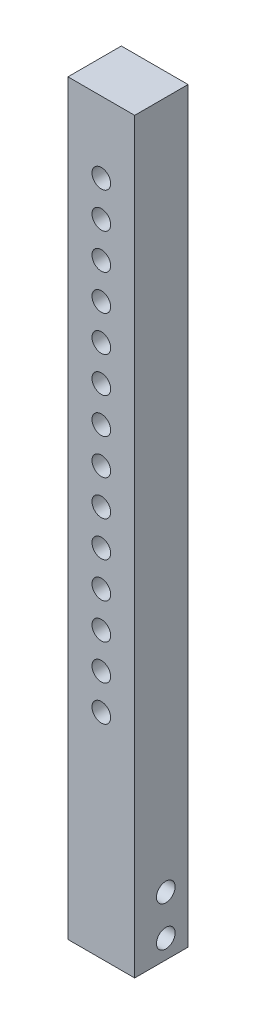
ISO-10303-21;
HEADER;
FILE_DESCRIPTION(('STEP AP214'),'2;1');
FILE_NAME('part.step','',(''),(''),'','','');
FILE_SCHEMA(('AUTOMOTIVE_DESIGN { 1 0 10303 214 1 1 1 1 }'));
ENDSEC;
DATA;
#1=APPLICATION_CONTEXT('core data for automotive mechanical design processes');
#2=APPLICATION_PROTOCOL_DEFINITION('international standard','automotive_design',2000,#1);
#3=PRODUCT_CONTEXT('',#1,'mechanical');
#4=PRODUCT('Part','Part','',(#3));
#5=PRODUCT_RELATED_PRODUCT_CATEGORY('part','',(#4));
#6=PRODUCT_DEFINITION_FORMATION('','',#4);
#7=PRODUCT_DEFINITION_CONTEXT('part definition',#1,'design');
#8=PRODUCT_DEFINITION('design','',#6,#7);
#9=PRODUCT_DEFINITION_SHAPE('','',#8);
#10=(LENGTH_UNIT() NAMED_UNIT(*) SI_UNIT(.MILLI.,.METRE.));
#11=(NAMED_UNIT(*) PLANE_ANGLE_UNIT() SI_UNIT($,.RADIAN.));
#12=(NAMED_UNIT(*) SI_UNIT($,.STERADIAN.) SOLID_ANGLE_UNIT());
#13=UNCERTAINTY_MEASURE_WITH_UNIT(LENGTH_MEASURE(1.E-05),#10,'distance_accuracy_value','');
#14=(GEOMETRIC_REPRESENTATION_CONTEXT(3) GLOBAL_UNCERTAINTY_ASSIGNED_CONTEXT((#13)) GLOBAL_UNIT_ASSIGNED_CONTEXT((#10,
#11,#12)) REPRESENTATION_CONTEXT('',''));
#15=CARTESIAN_POINT('',(0.,0.,0.));
#16=DIRECTION('',(0.,0.,1.));
#17=DIRECTION('',(1.,0.,0.));
#18=AXIS2_PLACEMENT_3D('',#15,#16,#17);
#19=CARTESIAN_POINT('',(-7.5,-85.,12.));
#20=DIRECTION('',(1.,0.,0.));
#21=DIRECTION('',(0.,0.,-1.));
#22=AXIS2_PLACEMENT_3D('',#19,#20,#21);
#23=PLANE('',#22);
#24=CARTESIAN_POINT('',(-7.5,-69.75,5.));
#25=DIRECTION('',(1.,0.,0.));
#26=DIRECTION('',(0.,0.,-1.));
#27=AXIS2_PLACEMENT_3D('',#24,#25,#26);
#28=CIRCLE('',#27,2.1);
#29=CARTESIAN_POINT('',(-7.5,-69.75,2.9));
#30=VERTEX_POINT('',#29);
#31=EDGE_CURVE('E163',#30,#30,#28,.F.);
#32=ORIENTED_EDGE('',*,*,#31,.F.);
#33=EDGE_LOOP('',(#32));
#34=FACE_BOUND('',#33,.T.);
#35=CARTESIAN_POINT('',(-7.5,-78.75,5.));
#36=DIRECTION('',(1.,0.,0.));
#37=DIRECTION('',(0.,0.,-1.));
#38=AXIS2_PLACEMENT_3D('',#35,#36,#37);
#39=CIRCLE('',#38,2.10000000000001);
#40=CARTESIAN_POINT('',(-7.5,-78.75,2.89999999999999));
#41=VERTEX_POINT('',#40);
#42=EDGE_CURVE('E342',#41,#41,#39,.F.);
#43=ORIENTED_EDGE('',*,*,#42,.F.);
#44=EDGE_LOOP('',(#43));
#45=FACE_BOUND('',#44,.T.);
#46=DIRECTION('',(0.,-1.,0.));
#47=VECTOR('',#46,1.);
#48=CARTESIAN_POINT('',(-7.5,-85.,0.));
#49=LINE('',#48,#47);
#50=CARTESIAN_POINT('',(-7.5,85.,0.));
#51=VERTEX_POINT('',#50);
#52=CARTESIAN_POINT('',(-7.5,-83.,0.));
#53=VERTEX_POINT('',#52);
#54=EDGE_CURVE('E127',#51,#53,#49,.T.);
#55=ORIENTED_EDGE('',*,*,#54,.T.);
#56=DIRECTION('',(0.,0.,-1.));
#57=VECTOR('',#56,1.);
#58=CARTESIAN_POINT('',(-7.5,-83.,0.));
#59=LINE('',#58,#57);
#60=CARTESIAN_POINT('',(-7.5,-83.,12.));
#61=VERTEX_POINT('',#60);
#62=EDGE_CURVE('E107',#61,#53,#59,.T.);
#63=ORIENTED_EDGE('',*,*,#62,.F.);
#64=DIRECTION('',(0.,-1.,0.));
#65=VECTOR('',#64,1.);
#66=CARTESIAN_POINT('',(-7.5,-85.,12.));
#67=LINE('',#66,#65);
#68=CARTESIAN_POINT('',(-7.5,85.,12.));
#69=VERTEX_POINT('',#68);
#70=EDGE_CURVE('E153',#69,#61,#67,.T.);
#71=ORIENTED_EDGE('',*,*,#70,.F.);
#72=DIRECTION('',(0.,0.,-1.));
#73=VECTOR('',#72,1.);
#74=CARTESIAN_POINT('',(-7.5,85.,12.));
#75=LINE('',#74,#73);
#76=EDGE_CURVE('E135',#69,#51,#75,.T.);
#77=ORIENTED_EDGE('',*,*,#76,.T.);
#78=EDGE_LOOP('',(#55,#63,#71,#77));
#79=FACE_BOUND('',#78,.T.);
#80=ADVANCED_FACE('F43',(#34,#45,#79),#23,.F.);
#81=CARTESIAN_POINT('',(7.5,-85.,12.));
#82=DIRECTION('',(-1.,0.,0.));
#83=DIRECTION('',(0.,0.,1.));
#84=AXIS2_PLACEMENT_3D('',#81,#82,#83);
#85=PLANE('',#84);
#86=CARTESIAN_POINT('',(7.5,-69.75,5.));
#87=DIRECTION('',(1.,0.,0.));
#88=DIRECTION('',(0.,0.,-1.));
#89=AXIS2_PLACEMENT_3D('',#86,#87,#88);
#90=CIRCLE('',#89,2.1);
#91=CARTESIAN_POINT('',(7.5,-69.75,2.9));
#92=VERTEX_POINT('',#91);
#93=EDGE_CURVE('E343',#92,#92,#90,.T.);
#94=ORIENTED_EDGE('',*,*,#93,.F.);
#95=EDGE_LOOP('',(#94));
#96=FACE_BOUND('',#95,.T.);
#97=CARTESIAN_POINT('',(7.5,-78.75,5.));
#98=DIRECTION('',(1.,0.,0.));
#99=DIRECTION('',(0.,0.,-1.));
#100=AXIS2_PLACEMENT_3D('',#97,#98,#99);
#101=CIRCLE('',#100,2.10000000000001);
#102=CARTESIAN_POINT('',(7.5,-78.75,2.89999999999999));
#103=VERTEX_POINT('',#102);
#104=EDGE_CURVE('E179',#103,#103,#101,.T.);
#105=ORIENTED_EDGE('',*,*,#104,.F.);
#106=EDGE_LOOP('',(#105));
#107=FACE_BOUND('',#106,.T.);
#108=DIRECTION('',(0.,1.,0.));
#109=VECTOR('',#108,1.);
#110=CARTESIAN_POINT('',(7.5,-85.,12.));
#111=LINE('',#110,#109);
#112=CARTESIAN_POINT('',(7.5,-83.,12.));
#113=VERTEX_POINT('',#112);
#114=CARTESIAN_POINT('',(7.5,85.,12.));
#115=VERTEX_POINT('',#114);
#116=EDGE_CURVE('E204',#113,#115,#111,.T.);
#117=ORIENTED_EDGE('',*,*,#116,.F.);
#118=DIRECTION('',(0.,0.,1.));
#119=VECTOR('',#118,1.);
#120=CARTESIAN_POINT('',(7.5,-83.,0.));
#121=LINE('',#120,#119);
#122=CARTESIAN_POINT('',(7.5,-83.,0.));
#123=VERTEX_POINT('',#122);
#124=EDGE_CURVE('E131',#123,#113,#121,.T.);
#125=ORIENTED_EDGE('',*,*,#124,.F.);
#126=DIRECTION('',(0.,1.,0.));
#127=VECTOR('',#126,1.);
#128=CARTESIAN_POINT('',(7.5,-85.,0.));
#129=LINE('',#128,#127);
#130=CARTESIAN_POINT('',(7.5,85.,0.));
#131=VERTEX_POINT('',#130);
#132=EDGE_CURVE('E137',#123,#131,#129,.T.);
#133=ORIENTED_EDGE('',*,*,#132,.T.);
#134=DIRECTION('',(0.,0.,-1.));
#135=VECTOR('',#134,1.);
#136=CARTESIAN_POINT('',(7.5,85.,12.));
#137=LINE('',#136,#135);
#138=EDGE_CURVE('E51',#115,#131,#137,.T.);
#139=ORIENTED_EDGE('',*,*,#138,.F.);
#140=EDGE_LOOP('',(#117,#125,#133,#139));
#141=FACE_BOUND('',#140,.T.);
#142=ADVANCED_FACE('F219',(#96,#107,#141),#85,.F.);
#143=CARTESIAN_POINT('',(7.5,85.,12.));
#144=DIRECTION('',(0.,-1.,0.));
#145=DIRECTION('',(0.,0.,-1.));
#146=AXIS2_PLACEMENT_3D('',#143,#144,#145);
#147=PLANE('',#146);
#148=DIRECTION('',(-1.,0.,0.));
#149=VECTOR('',#148,1.);
#150=CARTESIAN_POINT('',(7.5,85.,0.));
#151=LINE('',#150,#149);
#152=EDGE_CURVE('E142',#131,#51,#151,.T.);
#153=ORIENTED_EDGE('',*,*,#152,.T.);
#154=ORIENTED_EDGE('',*,*,#76,.F.);
#155=DIRECTION('',(-1.,0.,0.));
#156=VECTOR('',#155,1.);
#157=CARTESIAN_POINT('',(7.5,85.,12.));
#158=LINE('',#157,#156);
#159=EDGE_CURVE('E148',#115,#69,#158,.T.);
#160=ORIENTED_EDGE('',*,*,#159,.F.);
#161=ORIENTED_EDGE('',*,*,#138,.T.);
#162=EDGE_LOOP('',(#153,#154,#160,#161));
#163=FACE_BOUND('',#162,.T.);
#164=ADVANCED_FACE('F214',(#163),#147,.F.);
#165=CARTESIAN_POINT('',(0.,0.,12.));
#166=DIRECTION('',(0.,0.,1.));
#167=DIRECTION('',(1.,0.,0.));
#168=AXIS2_PLACEMENT_3D('',#165,#166,#167);
#169=PLANE('',#168);
#170=DIRECTION('',(-1.,0.,0.));
#171=VECTOR('',#170,1.);
#172=CARTESIAN_POINT('',(-7.5,-83.,12.));
#173=LINE('',#172,#171);
#174=EDGE_CURVE('E113',#113,#61,#173,.T.);
#175=ORIENTED_EDGE('',*,*,#174,.F.);
#176=ORIENTED_EDGE('',*,*,#116,.T.);
#177=ORIENTED_EDGE('',*,*,#159,.T.);
#178=ORIENTED_EDGE('',*,*,#70,.T.);
#179=EDGE_LOOP('',(#175,#176,#177,#178));
#180=FACE_BOUND('',#179,.T.);
#181=CARTESIAN_POINT('',(0.,-3.00000000000002,12.));
#182=DIRECTION('',(0.,0.,1.));
#183=DIRECTION('',(1.,0.,0.));
#184=AXIS2_PLACEMENT_3D('',#181,#182,#183);
#185=CIRCLE('',#184,2.1);
#186=CARTESIAN_POINT('',(2.1,-3.00000000000002,12.));
#187=VERTEX_POINT('',#186);
#188=EDGE_CURVE('E291',#187,#187,#185,.T.);
#189=ORIENTED_EDGE('',*,*,#188,.F.);
#190=EDGE_LOOP('',(#189));
#191=FACE_BOUND('',#190,.T.);
#192=CARTESIAN_POINT('',(0.,21.,12.));
#193=DIRECTION('',(0.,0.,1.));
#194=DIRECTION('',(1.,0.,0.));
#195=AXIS2_PLACEMENT_3D('',#192,#193,#194);
#196=CIRCLE('',#195,2.1);
#197=CARTESIAN_POINT('',(2.1,21.,12.));
#198=VERTEX_POINT('',#197);
#199=EDGE_CURVE('E292',#198,#198,#196,.T.);
#200=ORIENTED_EDGE('',*,*,#199,.F.);
#201=EDGE_LOOP('',(#200));
#202=FACE_BOUND('',#201,.T.);
#203=CARTESIAN_POINT('',(0.,13.,12.));
#204=DIRECTION('',(0.,0.,1.));
#205=DIRECTION('',(1.,0.,0.));
#206=AXIS2_PLACEMENT_3D('',#203,#204,#205);
#207=CIRCLE('',#206,2.1);
#208=CARTESIAN_POINT('',(2.1,13.,12.));
#209=VERTEX_POINT('',#208);
#210=EDGE_CURVE('E275',#209,#209,#207,.T.);
#211=ORIENTED_EDGE('',*,*,#210,.F.);
#212=EDGE_LOOP('',(#211));
#213=FACE_BOUND('',#212,.T.);
#214=CARTESIAN_POINT('',(0.,37.,12.));
#215=DIRECTION('',(0.,0.,1.));
#216=DIRECTION('',(1.,0.,0.));
#217=AXIS2_PLACEMENT_3D('',#214,#215,#216);
#218=CIRCLE('',#217,2.1);
#219=CARTESIAN_POINT('',(2.1,37.,12.));
#220=VERTEX_POINT('',#219);
#221=EDGE_CURVE('E276',#220,#220,#218,.T.);
#222=ORIENTED_EDGE('',*,*,#221,.F.);
#223=EDGE_LOOP('',(#222));
#224=FACE_BOUND('',#223,.T.);
#225=CARTESIAN_POINT('',(0.,-35.,12.));
#226=DIRECTION('',(0.,0.,1.));
#227=DIRECTION('',(1.,0.,0.));
#228=AXIS2_PLACEMENT_3D('',#225,#226,#227);
#229=CIRCLE('',#228,2.1);
#230=CARTESIAN_POINT('',(2.1,-35.,12.));
#231=VERTEX_POINT('',#230);
#232=EDGE_CURVE('E323',#231,#231,#229,.T.);
#233=ORIENTED_EDGE('',*,*,#232,.F.);
#234=EDGE_LOOP('',(#233));
#235=FACE_BOUND('',#234,.T.);
#236=CARTESIAN_POINT('',(0.,-11.,12.));
#237=DIRECTION('',(0.,0.,1.));
#238=DIRECTION('',(1.,0.,0.));
#239=AXIS2_PLACEMENT_3D('',#236,#237,#238);
#240=CIRCLE('',#239,2.1);
#241=CARTESIAN_POINT('',(2.1,-11.,12.));
#242=VERTEX_POINT('',#241);
#243=EDGE_CURVE('E324',#242,#242,#240,.T.);
#244=ORIENTED_EDGE('',*,*,#243,.F.);
#245=EDGE_LOOP('',(#244));
#246=FACE_BOUND('',#245,.T.);
#247=CARTESIAN_POINT('',(0.,-19.,12.));
#248=DIRECTION('',(0.,0.,1.));
#249=DIRECTION('',(1.,0.,0.));
#250=AXIS2_PLACEMENT_3D('',#247,#248,#249);
#251=CIRCLE('',#250,2.1);
#252=CARTESIAN_POINT('',(2.1,-19.,12.));
#253=VERTEX_POINT('',#252);
#254=EDGE_CURVE('E307',#253,#253,#251,.T.);
#255=ORIENTED_EDGE('',*,*,#254,.F.);
#256=EDGE_LOOP('',(#255));
#257=FACE_BOUND('',#256,.T.);
#258=CARTESIAN_POINT('',(0.,4.99999999999998,12.));
#259=DIRECTION('',(0.,0.,1.));
#260=DIRECTION('',(1.,0.,0.));
#261=AXIS2_PLACEMENT_3D('',#258,#259,#260);
#262=CIRCLE('',#261,2.1);
#263=CARTESIAN_POINT('',(2.1,4.99999999999998,12.));
#264=VERTEX_POINT('',#263);
#265=EDGE_CURVE('E308',#264,#264,#262,.T.);
#266=ORIENTED_EDGE('',*,*,#265,.F.);
#267=EDGE_LOOP('',(#266));
#268=FACE_BOUND('',#267,.T.);
#269=CARTESIAN_POINT('',(0.,61.,12.));
#270=DIRECTION('',(0.,0.,1.));
#271=DIRECTION('',(1.,0.,0.));
#272=AXIS2_PLACEMENT_3D('',#269,#270,#271);
#273=CIRCLE('',#272,2.1);
#274=CARTESIAN_POINT('',(2.1,61.,12.));
#275=VERTEX_POINT('',#274);
#276=EDGE_CURVE('E234',#275,#275,#273,.T.);
#277=ORIENTED_EDGE('',*,*,#276,.F.);
#278=EDGE_LOOP('',(#277));
#279=FACE_BOUND('',#278,.T.);
#280=CARTESIAN_POINT('',(0.,29.,12.));
#281=DIRECTION('',(0.,0.,1.));
#282=DIRECTION('',(1.,0.,0.));
#283=AXIS2_PLACEMENT_3D('',#280,#281,#282);
#284=CIRCLE('',#283,2.1);
#285=CARTESIAN_POINT('',(2.1,29.,12.));
#286=VERTEX_POINT('',#285);
#287=EDGE_CURVE('E259',#286,#286,#284,.T.);
#288=ORIENTED_EDGE('',*,*,#287,.F.);
#289=EDGE_LOOP('',(#288));
#290=FACE_BOUND('',#289,.T.);
#291=CARTESIAN_POINT('',(0.,53.,12.));
#292=DIRECTION('',(0.,0.,1.));
#293=DIRECTION('',(1.,0.,0.));
#294=AXIS2_PLACEMENT_3D('',#291,#292,#293);
#295=CIRCLE('',#294,2.1);
#296=CARTESIAN_POINT('',(2.1,53.,12.));
#297=VERTEX_POINT('',#296);
#298=EDGE_CURVE('E260',#297,#297,#295,.T.);
#299=ORIENTED_EDGE('',*,*,#298,.F.);
#300=EDGE_LOOP('',(#299));
#301=FACE_BOUND('',#300,.T.);
#302=CARTESIAN_POINT('',(0.,45.,12.));
#303=DIRECTION('',(0.,0.,1.));
#304=DIRECTION('',(1.,0.,0.));
#305=AXIS2_PLACEMENT_3D('',#302,#303,#304);
#306=CIRCLE('',#305,2.1);
#307=CARTESIAN_POINT('',(2.1,45.,12.));
#308=VERTEX_POINT('',#307);
#309=EDGE_CURVE('E243',#308,#308,#306,.T.);
#310=ORIENTED_EDGE('',*,*,#309,.F.);
#311=EDGE_LOOP('',(#310));
#312=FACE_BOUND('',#311,.T.);
#313=CARTESIAN_POINT('',(0.,69.,12.));
#314=DIRECTION('',(0.,0.,1.));
#315=DIRECTION('',(1.,0.,0.));
#316=AXIS2_PLACEMENT_3D('',#313,#314,#315);
#317=CIRCLE('',#316,2.1);
#318=CARTESIAN_POINT('',(2.1,69.,12.));
#319=VERTEX_POINT('',#318);
#320=EDGE_CURVE('E244',#319,#319,#317,.T.);
#321=ORIENTED_EDGE('',*,*,#320,.F.);
#322=EDGE_LOOP('',(#321));
#323=FACE_BOUND('',#322,.T.);
#324=CARTESIAN_POINT('',(0.,-27.,12.));
#325=DIRECTION('',(0.,0.,1.));
#326=DIRECTION('',(1.,0.,0.));
#327=AXIS2_PLACEMENT_3D('',#324,#325,#326);
#328=CIRCLE('',#327,2.1);
#329=CARTESIAN_POINT('',(2.1,-27.,12.));
#330=VERTEX_POINT('',#329);
#331=EDGE_CURVE('E328',#330,#330,#328,.T.);
#332=ORIENTED_EDGE('',*,*,#331,.F.);
#333=EDGE_LOOP('',(#332));
#334=FACE_BOUND('',#333,.T.);
#335=ADVANCED_FACE('F211',(#180,#191,#202,#213,#224,#235,#246,#257,#268,#279,#290,#301,#312,
#323,#334),#169,.T.);
#336=CARTESIAN_POINT('',(0.,0.,0.));
#337=DIRECTION('',(0.,0.,1.));
#338=DIRECTION('',(1.,0.,0.));
#339=AXIS2_PLACEMENT_3D('',#336,#337,#338);
#340=PLANE('',#339);
#341=CARTESIAN_POINT('',(0.,-3.00000000000002,0.));
#342=DIRECTION('',(0.,0.,1.));
#343=DIRECTION('',(1.,0.,0.));
#344=AXIS2_PLACEMENT_3D('',#341,#342,#343);
#345=CIRCLE('',#344,2.1);
#346=CARTESIAN_POINT('',(2.1,-3.00000000000002,0.));
#347=VERTEX_POINT('',#346);
#348=EDGE_CURVE('E287',#347,#347,#345,.F.);
#349=ORIENTED_EDGE('',*,*,#348,.F.);
#350=EDGE_LOOP('',(#349));
#351=FACE_BOUND('',#350,.T.);
#352=CARTESIAN_POINT('',(0.,21.,0.));
#353=DIRECTION('',(0.,0.,1.));
#354=DIRECTION('',(1.,0.,0.));
#355=AXIS2_PLACEMENT_3D('',#352,#353,#354);
#356=CIRCLE('',#355,2.1);
#357=CARTESIAN_POINT('',(2.1,21.,0.));
#358=VERTEX_POINT('',#357);
#359=EDGE_CURVE('E280',#358,#358,#356,.F.);
#360=ORIENTED_EDGE('',*,*,#359,.F.);
#361=EDGE_LOOP('',(#360));
#362=FACE_BOUND('',#361,.T.);
#363=CARTESIAN_POINT('',(0.,13.,0.));
#364=DIRECTION('',(0.,0.,1.));
#365=DIRECTION('',(1.,0.,0.));
#366=AXIS2_PLACEMENT_3D('',#363,#364,#365);
#367=CIRCLE('',#366,2.1);
#368=CARTESIAN_POINT('',(2.1,13.,0.));
#369=VERTEX_POINT('',#368);
#370=EDGE_CURVE('E271',#369,#369,#367,.F.);
#371=ORIENTED_EDGE('',*,*,#370,.F.);
#372=EDGE_LOOP('',(#371));
#373=FACE_BOUND('',#372,.T.);
#374=CARTESIAN_POINT('',(0.,37.,0.));
#375=DIRECTION('',(0.,0.,1.));
#376=DIRECTION('',(1.,0.,0.));
#377=AXIS2_PLACEMENT_3D('',#374,#375,#376);
#378=CIRCLE('',#377,2.1);
#379=CARTESIAN_POINT('',(2.1,37.,0.));
#380=VERTEX_POINT('',#379);
#381=EDGE_CURVE('E264',#380,#380,#378,.F.);
#382=ORIENTED_EDGE('',*,*,#381,.F.);
#383=EDGE_LOOP('',(#382));
#384=FACE_BOUND('',#383,.T.);
#385=CARTESIAN_POINT('',(0.,-35.,0.));
#386=DIRECTION('',(0.,0.,1.));
#387=DIRECTION('',(1.,0.,0.));
#388=AXIS2_PLACEMENT_3D('',#385,#386,#387);
#389=CIRCLE('',#388,2.1);
#390=CARTESIAN_POINT('',(2.1,-35.,0.));
#391=VERTEX_POINT('',#390);
#392=EDGE_CURVE('E319',#391,#391,#389,.F.);
#393=ORIENTED_EDGE('',*,*,#392,.F.);
#394=EDGE_LOOP('',(#393));
#395=FACE_BOUND('',#394,.T.);
#396=CARTESIAN_POINT('',(0.,-11.,0.));
#397=DIRECTION('',(0.,0.,1.));
#398=DIRECTION('',(1.,0.,0.));
#399=AXIS2_PLACEMENT_3D('',#396,#397,#398);
#400=CIRCLE('',#399,2.1);
#401=CARTESIAN_POINT('',(2.1,-11.,0.));
#402=VERTEX_POINT('',#401);
#403=EDGE_CURVE('E312',#402,#402,#400,.F.);
#404=ORIENTED_EDGE('',*,*,#403,.F.);
#405=EDGE_LOOP('',(#404));
#406=FACE_BOUND('',#405,.T.);
#407=CARTESIAN_POINT('',(0.,-19.,0.));
#408=DIRECTION('',(0.,0.,1.));
#409=DIRECTION('',(1.,0.,0.));
#410=AXIS2_PLACEMENT_3D('',#407,#408,#409);
#411=CIRCLE('',#410,2.1);
#412=CARTESIAN_POINT('',(2.1,-19.,0.));
#413=VERTEX_POINT('',#412);
#414=EDGE_CURVE('E303',#413,#413,#411,.F.);
#415=ORIENTED_EDGE('',*,*,#414,.F.);
#416=EDGE_LOOP('',(#415));
#417=FACE_BOUND('',#416,.T.);
#418=CARTESIAN_POINT('',(0.,4.99999999999998,0.));
#419=DIRECTION('',(0.,0.,1.));
#420=DIRECTION('',(1.,0.,0.));
#421=AXIS2_PLACEMENT_3D('',#418,#419,#420);
#422=CIRCLE('',#421,2.1);
#423=CARTESIAN_POINT('',(2.1,4.99999999999998,0.));
#424=VERTEX_POINT('',#423);
#425=EDGE_CURVE('E296',#424,#424,#422,.F.);
#426=ORIENTED_EDGE('',*,*,#425,.F.);
#427=EDGE_LOOP('',(#426));
#428=FACE_BOUND('',#427,.T.);
#429=CARTESIAN_POINT('',(0.,61.,0.));
#430=DIRECTION('',(0.,0.,1.));
#431=DIRECTION('',(1.,0.,0.));
#432=AXIS2_PLACEMENT_3D('',#429,#430,#431);
#433=CIRCLE('',#432,2.1);
#434=CARTESIAN_POINT('',(2.1,61.,0.));
#435=VERTEX_POINT('',#434);
#436=EDGE_CURVE('E230',#435,#435,#433,.F.);
#437=ORIENTED_EDGE('',*,*,#436,.F.);
#438=EDGE_LOOP('',(#437));
#439=FACE_BOUND('',#438,.T.);
#440=CARTESIAN_POINT('',(0.,29.,0.));
#441=DIRECTION('',(0.,0.,1.));
#442=DIRECTION('',(1.,0.,0.));
#443=AXIS2_PLACEMENT_3D('',#440,#441,#442);
#444=CIRCLE('',#443,2.1);
#445=CARTESIAN_POINT('',(2.1,29.,0.));
#446=VERTEX_POINT('',#445);
#447=EDGE_CURVE('E255',#446,#446,#444,.F.);
#448=ORIENTED_EDGE('',*,*,#447,.F.);
#449=EDGE_LOOP('',(#448));
#450=FACE_BOUND('',#449,.T.);
#451=CARTESIAN_POINT('',(0.,53.,0.));
#452=DIRECTION('',(0.,0.,1.));
#453=DIRECTION('',(1.,0.,0.));
#454=AXIS2_PLACEMENT_3D('',#451,#452,#453);
#455=CIRCLE('',#454,2.1);
#456=CARTESIAN_POINT('',(2.1,53.,0.));
#457=VERTEX_POINT('',#456);
#458=EDGE_CURVE('E248',#457,#457,#455,.F.);
#459=ORIENTED_EDGE('',*,*,#458,.F.);
#460=EDGE_LOOP('',(#459));
#461=FACE_BOUND('',#460,.T.);
#462=CARTESIAN_POINT('',(0.,45.,0.));
#463=DIRECTION('',(0.,0.,1.));
#464=DIRECTION('',(1.,0.,0.));
#465=AXIS2_PLACEMENT_3D('',#462,#463,#464);
#466=CIRCLE('',#465,2.1);
#467=CARTESIAN_POINT('',(2.1,45.,0.));
#468=VERTEX_POINT('',#467);
#469=EDGE_CURVE('E239',#468,#468,#466,.F.);
#470=ORIENTED_EDGE('',*,*,#469,.F.);
#471=EDGE_LOOP('',(#470));
#472=FACE_BOUND('',#471,.T.);
#473=CARTESIAN_POINT('',(0.,69.,0.));
#474=DIRECTION('',(0.,0.,1.));
#475=DIRECTION('',(1.,0.,0.));
#476=AXIS2_PLACEMENT_3D('',#473,#474,#475);
#477=CIRCLE('',#476,2.1);
#478=CARTESIAN_POINT('',(2.1,69.,0.));
#479=VERTEX_POINT('',#478);
#480=EDGE_CURVE('E238',#479,#479,#477,.F.);
#481=ORIENTED_EDGE('',*,*,#480,.F.);
#482=EDGE_LOOP('',(#481));
#483=FACE_BOUND('',#482,.T.);
#484=CARTESIAN_POINT('',(0.,-27.,0.));
#485=DIRECTION('',(0.,0.,1.));
#486=DIRECTION('',(1.,0.,0.));
#487=AXIS2_PLACEMENT_3D('',#484,#485,#486);
#488=CIRCLE('',#487,2.1);
#489=CARTESIAN_POINT('',(2.1,-27.,0.));
#490=VERTEX_POINT('',#489);
#491=EDGE_CURVE('E338',#490,#490,#488,.F.);
#492=ORIENTED_EDGE('',*,*,#491,.F.);
#493=EDGE_LOOP('',(#492));
#494=FACE_BOUND('',#493,.T.);
#495=ORIENTED_EDGE('',*,*,#132,.F.);
#496=DIRECTION('',(1.,0.,0.));
#497=VECTOR('',#496,1.);
#498=CARTESIAN_POINT('',(-7.5,-83.,0.));
#499=LINE('',#498,#497);
#500=CARTESIAN_POINT('',(2.55,-83.,0.));
#501=VERTEX_POINT('',#500);
#502=EDGE_CURVE('E119',#501,#123,#499,.T.);
#503=ORIENTED_EDGE('',*,*,#502,.F.);
#504=DIRECTION('',(0.,-1.,0.));
#505=VECTOR('',#504,1.);
#506=CARTESIAN_POINT('',(2.55,-64.5,0.));
#507=LINE('',#506,#505);
#508=CARTESIAN_POINT('',(2.55,-64.5,0.));
#509=VERTEX_POINT('',#508);
#510=EDGE_CURVE('E197',#509,#501,#507,.T.);
#511=ORIENTED_EDGE('',*,*,#510,.F.);
#512=DIRECTION('',(1.,0.,0.));
#513=VECTOR('',#512,1.);
#514=CARTESIAN_POINT('',(-5.55,-64.5,0.));
#515=LINE('',#514,#513);
#516=CARTESIAN_POINT('',(-5.55,-64.5,0.));
#517=VERTEX_POINT('',#516);
#518=EDGE_CURVE('E184',#517,#509,#515,.T.);
#519=ORIENTED_EDGE('',*,*,#518,.F.);
#520=DIRECTION('',(0.,-1.,0.));
#521=VECTOR('',#520,1.);
#522=CARTESIAN_POINT('',(-5.55,-64.5,0.));
#523=LINE('',#522,#521);
#524=CARTESIAN_POINT('',(-5.55,-83.,0.));
#525=VERTEX_POINT('',#524);
#526=EDGE_CURVE('E129',#517,#525,#523,.T.);
#527=ORIENTED_EDGE('',*,*,#526,.T.);
#528=EDGE_CURVE('E110',#53,#525,#499,.T.);
#529=ORIENTED_EDGE('',*,*,#528,.F.);
#530=ORIENTED_EDGE('',*,*,#54,.F.);
#531=ORIENTED_EDGE('',*,*,#152,.F.);
#532=EDGE_LOOP('',(#495,#503,#511,#519,#527,#529,#530,#531));
#533=FACE_BOUND('',#532,.T.);
#534=ADVANCED_FACE('F125',(#351,#362,#373,#384,#395,#406,#417,#428,#439,#450,#461,#472,#483,
#494,#533),#340,.F.);
#535=CARTESIAN_POINT('',(-5.55,-64.5,0.));
#536=DIRECTION('',(-1.,0.,0.));
#537=DIRECTION('',(0.,0.,1.));
#538=AXIS2_PLACEMENT_3D('',#535,#536,#537);
#539=PLANE('',#538);
#540=CARTESIAN_POINT('',(-5.55,-69.75,5.));
#541=DIRECTION('',(-1.,0.,0.));
#542=DIRECTION('',(0.,0.,1.));
#543=AXIS2_PLACEMENT_3D('',#540,#541,#542);
#544=CIRCLE('',#543,2.1);
#545=CARTESIAN_POINT('',(-5.55,-69.75,7.1));
#546=VERTEX_POINT('',#545);
#547=EDGE_CURVE('E167',#546,#546,#544,.T.);
#548=ORIENTED_EDGE('',*,*,#547,.T.);
#549=EDGE_LOOP('',(#548));
#550=FACE_BOUND('',#549,.T.);
#551=CARTESIAN_POINT('',(-5.55,-78.75,5.));
#552=DIRECTION('',(-1.,0.,0.));
#553=DIRECTION('',(0.,0.,1.));
#554=AXIS2_PLACEMENT_3D('',#551,#552,#553);
#555=CIRCLE('',#554,2.10000000000001);
#556=CARTESIAN_POINT('',(-5.55,-78.75,7.10000000000001));
#557=VERTEX_POINT('',#556);
#558=EDGE_CURVE('E162',#557,#557,#555,.T.);
#559=ORIENTED_EDGE('',*,*,#558,.T.);
#560=EDGE_LOOP('',(#559));
#561=FACE_BOUND('',#560,.T.);
#562=DIRECTION('',(0.,-1.,0.));
#563=VECTOR('',#562,1.);
#564=CARTESIAN_POINT('',(-5.55,-64.5,10.1));
#565=LINE('',#564,#563);
#566=CARTESIAN_POINT('',(-5.55,-64.5,10.1));
#567=VERTEX_POINT('',#566);
#568=CARTESIAN_POINT('',(-5.55,-83.,10.1));
#569=VERTEX_POINT('',#568);
#570=EDGE_CURVE('E138',#567,#569,#565,.T.);
#571=ORIENTED_EDGE('',*,*,#570,.T.);
#572=DIRECTION('',(0.,0.,-1.));
#573=VECTOR('',#572,1.);
#574=CARTESIAN_POINT('',(-5.55,-83.,0.));
#575=LINE('',#574,#573);
#576=EDGE_CURVE('E227',#569,#525,#575,.T.);
#577=ORIENTED_EDGE('',*,*,#576,.T.);
#578=ORIENTED_EDGE('',*,*,#526,.F.);
#579=DIRECTION('',(0.,0.,-1.));
#580=VECTOR('',#579,1.);
#581=CARTESIAN_POINT('',(-5.55,-64.5,0.));
#582=LINE('',#581,#580);
#583=EDGE_CURVE('E65',#567,#517,#582,.T.);
#584=ORIENTED_EDGE('',*,*,#583,.F.);
#585=EDGE_LOOP('',(#571,#577,#578,#584));
#586=FACE_BOUND('',#585,.T.);
#587=ADVANCED_FACE('F372',(#550,#561,#586),#539,.F.);
#588=CARTESIAN_POINT('',(-5.55,-64.5,10.1));
#589=DIRECTION('',(0.,0.,1.));
#590=DIRECTION('',(1.,0.,0.));
#591=AXIS2_PLACEMENT_3D('',#588,#589,#590);
#592=PLANE('',#591);
#593=DIRECTION('',(0.,-1.,0.));
#594=VECTOR('',#593,1.);
#595=CARTESIAN_POINT('',(2.55,-64.5,10.1));
#596=LINE('',#595,#594);
#597=CARTESIAN_POINT('',(2.55,-64.5,10.1));
#598=VERTEX_POINT('',#597);
#599=CARTESIAN_POINT('',(2.55,-83.,10.1));
#600=VERTEX_POINT('',#599);
#601=EDGE_CURVE('E145',#598,#600,#596,.T.);
#602=ORIENTED_EDGE('',*,*,#601,.T.);
#603=DIRECTION('',(-1.,0.,0.));
#604=VECTOR('',#603,1.);
#605=CARTESIAN_POINT('',(-5.55,-83.,10.1));
#606=LINE('',#605,#604);
#607=EDGE_CURVE('E58',#600,#569,#606,.T.);
#608=ORIENTED_EDGE('',*,*,#607,.T.);
#609=ORIENTED_EDGE('',*,*,#570,.F.);
#610=DIRECTION('',(-1.,0.,0.));
#611=VECTOR('',#610,1.);
#612=CARTESIAN_POINT('',(-5.55,-64.5,10.1));
#613=LINE('',#612,#611);
#614=EDGE_CURVE('E191',#598,#567,#613,.T.);
#615=ORIENTED_EDGE('',*,*,#614,.F.);
#616=EDGE_LOOP('',(#602,#608,#609,#615));
#617=FACE_BOUND('',#616,.T.);
#618=ADVANCED_FACE('F378',(#617),#592,.F.);
#619=CARTESIAN_POINT('',(2.55,-64.5,0.));
#620=DIRECTION('',(1.,0.,0.));
#621=DIRECTION('',(0.,0.,-1.));
#622=AXIS2_PLACEMENT_3D('',#619,#620,#621);
#623=PLANE('',#622);
#624=CARTESIAN_POINT('',(2.55,-69.75,5.));
#625=DIRECTION('',(1.,0.,0.));
#626=DIRECTION('',(0.,0.,-1.));
#627=AXIS2_PLACEMENT_3D('',#624,#625,#626);
#628=CIRCLE('',#627,2.1);
#629=CARTESIAN_POINT('',(2.55,-69.75,2.9));
#630=VERTEX_POINT('',#629);
#631=EDGE_CURVE('E164',#630,#630,#628,.T.);
#632=ORIENTED_EDGE('',*,*,#631,.T.);
#633=EDGE_LOOP('',(#632));
#634=FACE_BOUND('',#633,.T.);
#635=CARTESIAN_POINT('',(2.55,-78.75,5.));
#636=DIRECTION('',(1.,0.,0.));
#637=DIRECTION('',(0.,0.,-1.));
#638=AXIS2_PLACEMENT_3D('',#635,#636,#637);
#639=CIRCLE('',#638,2.10000000000001);
#640=CARTESIAN_POINT('',(2.55,-78.75,2.89999999999999));
#641=VERTEX_POINT('',#640);
#642=EDGE_CURVE('E159',#641,#641,#639,.T.);
#643=ORIENTED_EDGE('',*,*,#642,.T.);
#644=EDGE_LOOP('',(#643));
#645=FACE_BOUND('',#644,.T.);
#646=ORIENTED_EDGE('',*,*,#510,.T.);
#647=DIRECTION('',(0.,0.,1.));
#648=VECTOR('',#647,1.);
#649=CARTESIAN_POINT('',(2.55,-83.,0.));
#650=LINE('',#649,#648);
#651=EDGE_CURVE('E11',#501,#600,#650,.T.);
#652=ORIENTED_EDGE('',*,*,#651,.T.);
#653=ORIENTED_EDGE('',*,*,#601,.F.);
#654=DIRECTION('',(0.,0.,1.));
#655=VECTOR('',#654,1.);
#656=CARTESIAN_POINT('',(2.55,-64.5,0.));
#657=LINE('',#656,#655);
#658=EDGE_CURVE('E187',#509,#598,#657,.T.);
#659=ORIENTED_EDGE('',*,*,#658,.F.);
#660=EDGE_LOOP('',(#646,#652,#653,#659));
#661=FACE_BOUND('',#660,.T.);
#662=ADVANCED_FACE('F380',(#634,#645,#661),#623,.F.);
#663=CARTESIAN_POINT('',(0.,-64.5,0.));
#664=DIRECTION('',(0.,1.,0.));
#665=DIRECTION('',(0.,0.,1.));
#666=AXIS2_PLACEMENT_3D('',#663,#664,#665);
#667=PLANE('',#666);
#668=ORIENTED_EDGE('',*,*,#583,.T.);
#669=ORIENTED_EDGE('',*,*,#518,.T.);
#670=ORIENTED_EDGE('',*,*,#658,.T.);
#671=ORIENTED_EDGE('',*,*,#614,.T.);
#672=EDGE_LOOP('',(#668,#669,#670,#671));
#673=FACE_BOUND('',#672,.T.);
#674=ADVANCED_FACE('F383',(#673),#667,.F.);
#675=CARTESIAN_POINT('',(-13.439696961967,-78.75,5.));
#676=DIRECTION('',(1.,0.,0.));
#677=DIRECTION('',(0.,0.,-1.));
#678=AXIS2_PLACEMENT_3D('',#675,#676,#677);
#679=CYLINDRICAL_SURFACE('',#678,2.10000000000001);
#680=ORIENTED_EDGE('',*,*,#104,.T.);
#681=EDGE_LOOP('',(#680));
#682=FACE_BOUND('',#681,.T.);
#683=ORIENTED_EDGE('',*,*,#642,.F.);
#684=EDGE_LOOP('',(#683));
#685=FACE_BOUND('',#684,.T.);
#686=ADVANCED_FACE('F357',(#682,#685),#679,.F.);
#687=CARTESIAN_POINT('',(-13.439696961967,-69.75,5.));
#688=DIRECTION('',(1.,0.,0.));
#689=DIRECTION('',(0.,0.,-1.));
#690=AXIS2_PLACEMENT_3D('',#687,#688,#689);
#691=CYLINDRICAL_SURFACE('',#690,2.1);
#692=ORIENTED_EDGE('',*,*,#93,.T.);
#693=EDGE_LOOP('',(#692));
#694=FACE_BOUND('',#693,.T.);
#695=ORIENTED_EDGE('',*,*,#631,.F.);
#696=EDGE_LOOP('',(#695));
#697=FACE_BOUND('',#696,.T.);
#698=ADVANCED_FACE('F393',(#694,#697),#691,.F.);
#699=ORIENTED_EDGE('',*,*,#42,.T.);
#700=EDGE_LOOP('',(#699));
#701=FACE_BOUND('',#700,.T.);
#702=ORIENTED_EDGE('',*,*,#558,.F.);
#703=EDGE_LOOP('',(#702));
#704=FACE_BOUND('',#703,.T.);
#705=ADVANCED_FACE('F389',(#701,#704),#679,.F.);
#706=ORIENTED_EDGE('',*,*,#31,.T.);
#707=EDGE_LOOP('',(#706));
#708=FACE_BOUND('',#707,.T.);
#709=ORIENTED_EDGE('',*,*,#547,.F.);
#710=EDGE_LOOP('',(#709));
#711=FACE_BOUND('',#710,.T.);
#712=ADVANCED_FACE('F392',(#708,#711),#691,.F.);
#713=CARTESIAN_POINT('',(0.,-27.,-5.93969696196701));
#714=DIRECTION('',(0.,0.,1.));
#715=DIRECTION('',(1.,0.,0.));
#716=AXIS2_PLACEMENT_3D('',#713,#714,#715);
#717=CYLINDRICAL_SURFACE('',#716,2.1);
#718=ORIENTED_EDGE('',*,*,#491,.T.);
#719=EDGE_LOOP('',(#718));
#720=FACE_BOUND('',#719,.T.);
#721=ORIENTED_EDGE('',*,*,#331,.T.);
#722=EDGE_LOOP('',(#721));
#723=FACE_BOUND('',#722,.T.);
#724=ADVANCED_FACE('F396',(#720,#723),#717,.F.);
#725=CARTESIAN_POINT('',(0.,69.,-5.93969696196701));
#726=DIRECTION('',(0.,0.,1.));
#727=DIRECTION('',(1.,0.,0.));
#728=AXIS2_PLACEMENT_3D('',#725,#726,#727);
#729=CYLINDRICAL_SURFACE('',#728,2.1);
#730=ORIENTED_EDGE('',*,*,#480,.T.);
#731=EDGE_LOOP('',(#730));
#732=FACE_BOUND('',#731,.T.);
#733=ORIENTED_EDGE('',*,*,#320,.T.);
#734=EDGE_LOOP('',(#733));
#735=FACE_BOUND('',#734,.T.);
#736=ADVANCED_FACE('F400',(#732,#735),#729,.F.);
#737=CARTESIAN_POINT('',(0.,45.,-5.93969696196701));
#738=DIRECTION('',(0.,0.,1.));
#739=DIRECTION('',(1.,0.,0.));
#740=AXIS2_PLACEMENT_3D('',#737,#738,#739);
#741=CYLINDRICAL_SURFACE('',#740,2.1);
#742=ORIENTED_EDGE('',*,*,#469,.T.);
#743=EDGE_LOOP('',(#742));
#744=FACE_BOUND('',#743,.T.);
#745=ORIENTED_EDGE('',*,*,#309,.T.);
#746=EDGE_LOOP('',(#745));
#747=FACE_BOUND('',#746,.T.);
#748=ADVANCED_FACE('F439',(#744,#747),#741,.F.);
#749=CARTESIAN_POINT('',(0.,53.,-5.93969696196701));
#750=DIRECTION('',(0.,0.,1.));
#751=DIRECTION('',(1.,0.,0.));
#752=AXIS2_PLACEMENT_3D('',#749,#750,#751);
#753=CYLINDRICAL_SURFACE('',#752,2.1);
#754=ORIENTED_EDGE('',*,*,#458,.T.);
#755=EDGE_LOOP('',(#754));
#756=FACE_BOUND('',#755,.T.);
#757=ORIENTED_EDGE('',*,*,#298,.T.);
#758=EDGE_LOOP('',(#757));
#759=FACE_BOUND('',#758,.T.);
#760=ADVANCED_FACE('F435',(#756,#759),#753,.F.);
#761=CARTESIAN_POINT('',(0.,29.,-5.93969696196701));
#762=DIRECTION('',(0.,0.,1.));
#763=DIRECTION('',(1.,0.,0.));
#764=AXIS2_PLACEMENT_3D('',#761,#762,#763);
#765=CYLINDRICAL_SURFACE('',#764,2.1);
#766=ORIENTED_EDGE('',*,*,#447,.T.);
#767=EDGE_LOOP('',(#766));
#768=FACE_BOUND('',#767,.T.);
#769=ORIENTED_EDGE('',*,*,#287,.T.);
#770=EDGE_LOOP('',(#769));
#771=FACE_BOUND('',#770,.T.);
#772=ADVANCED_FACE('F438',(#768,#771),#765,.F.);
#773=CARTESIAN_POINT('',(0.,61.,-5.93969696196701));
#774=DIRECTION('',(0.,0.,1.));
#775=DIRECTION('',(1.,0.,0.));
#776=AXIS2_PLACEMENT_3D('',#773,#774,#775);
#777=CYLINDRICAL_SURFACE('',#776,2.1);
#778=ORIENTED_EDGE('',*,*,#436,.T.);
#779=EDGE_LOOP('',(#778));
#780=FACE_BOUND('',#779,.T.);
#781=ORIENTED_EDGE('',*,*,#276,.T.);
#782=EDGE_LOOP('',(#781));
#783=FACE_BOUND('',#782,.T.);
#784=ADVANCED_FACE('F415',(#780,#783),#777,.F.);
#785=CARTESIAN_POINT('',(0.,4.99999999999998,-5.93969696196701));
#786=DIRECTION('',(0.,0.,1.));
#787=DIRECTION('',(1.,0.,0.));
#788=AXIS2_PLACEMENT_3D('',#785,#786,#787);
#789=CYLINDRICAL_SURFACE('',#788,2.1);
#790=ORIENTED_EDGE('',*,*,#425,.T.);
#791=EDGE_LOOP('',(#790));
#792=FACE_BOUND('',#791,.T.);
#793=ORIENTED_EDGE('',*,*,#265,.T.);
#794=EDGE_LOOP('',(#793));
#795=FACE_BOUND('',#794,.T.);
#796=ADVANCED_FACE('F412',(#792,#795),#789,.F.);
#797=CARTESIAN_POINT('',(0.,-19.,-5.93969696196701));
#798=DIRECTION('',(0.,0.,1.));
#799=DIRECTION('',(1.,0.,0.));
#800=AXIS2_PLACEMENT_3D('',#797,#798,#799);
#801=CYLINDRICAL_SURFACE('',#800,2.1);
#802=ORIENTED_EDGE('',*,*,#414,.T.);
#803=EDGE_LOOP('',(#802));
#804=FACE_BOUND('',#803,.T.);
#805=ORIENTED_EDGE('',*,*,#254,.T.);
#806=EDGE_LOOP('',(#805));
#807=FACE_BOUND('',#806,.T.);
#808=ADVANCED_FACE('F406',(#804,#807),#801,.F.);
#809=CARTESIAN_POINT('',(0.,-11.,-5.93969696196701));
#810=DIRECTION('',(0.,0.,1.));
#811=DIRECTION('',(1.,0.,0.));
#812=AXIS2_PLACEMENT_3D('',#809,#810,#811);
#813=CYLINDRICAL_SURFACE('',#812,2.1);
#814=ORIENTED_EDGE('',*,*,#403,.T.);
#815=EDGE_LOOP('',(#814));
#816=FACE_BOUND('',#815,.T.);
#817=ORIENTED_EDGE('',*,*,#243,.T.);
#818=EDGE_LOOP('',(#817));
#819=FACE_BOUND('',#818,.T.);
#820=ADVANCED_FACE('F402',(#816,#819),#813,.F.);
#821=CARTESIAN_POINT('',(0.,-35.,-5.93969696196701));
#822=DIRECTION('',(0.,0.,1.));
#823=DIRECTION('',(1.,0.,0.));
#824=AXIS2_PLACEMENT_3D('',#821,#822,#823);
#825=CYLINDRICAL_SURFACE('',#824,2.1);
#826=ORIENTED_EDGE('',*,*,#392,.T.);
#827=EDGE_LOOP('',(#826));
#828=FACE_BOUND('',#827,.T.);
#829=ORIENTED_EDGE('',*,*,#232,.T.);
#830=EDGE_LOOP('',(#829));
#831=FACE_BOUND('',#830,.T.);
#832=ADVANCED_FACE('F405',(#828,#831),#825,.F.);
#833=CARTESIAN_POINT('',(0.,37.,-5.93969696196701));
#834=DIRECTION('',(0.,0.,1.));
#835=DIRECTION('',(1.,0.,0.));
#836=AXIS2_PLACEMENT_3D('',#833,#834,#835);
#837=CYLINDRICAL_SURFACE('',#836,2.1);
#838=ORIENTED_EDGE('',*,*,#381,.T.);
#839=EDGE_LOOP('',(#838));
#840=FACE_BOUND('',#839,.T.);
#841=ORIENTED_EDGE('',*,*,#221,.T.);
#842=EDGE_LOOP('',(#841));
#843=FACE_BOUND('',#842,.T.);
#844=ADVANCED_FACE('F410',(#840,#843),#837,.F.);
#845=CARTESIAN_POINT('',(0.,13.,-5.93969696196701));
#846=DIRECTION('',(0.,0.,1.));
#847=DIRECTION('',(1.,0.,0.));
#848=AXIS2_PLACEMENT_3D('',#845,#846,#847);
#849=CYLINDRICAL_SURFACE('',#848,2.1);
#850=ORIENTED_EDGE('',*,*,#370,.T.);
#851=EDGE_LOOP('',(#850));
#852=FACE_BOUND('',#851,.T.);
#853=ORIENTED_EDGE('',*,*,#210,.T.);
#854=EDGE_LOOP('',(#853));
#855=FACE_BOUND('',#854,.T.);
#856=ADVANCED_FACE('F424',(#852,#855),#849,.F.);
#857=CARTESIAN_POINT('',(0.,21.,-5.93969696196701));
#858=DIRECTION('',(0.,0.,1.));
#859=DIRECTION('',(1.,0.,0.));
#860=AXIS2_PLACEMENT_3D('',#857,#858,#859);
#861=CYLINDRICAL_SURFACE('',#860,2.1);
#862=ORIENTED_EDGE('',*,*,#359,.T.);
#863=EDGE_LOOP('',(#862));
#864=FACE_BOUND('',#863,.T.);
#865=ORIENTED_EDGE('',*,*,#199,.T.);
#866=EDGE_LOOP('',(#865));
#867=FACE_BOUND('',#866,.T.);
#868=ADVANCED_FACE('F420',(#864,#867),#861,.F.);
#869=CARTESIAN_POINT('',(0.,-3.00000000000002,-5.93969696196701));
#870=DIRECTION('',(0.,0.,1.));
#871=DIRECTION('',(1.,0.,0.));
#872=AXIS2_PLACEMENT_3D('',#869,#870,#871);
#873=CYLINDRICAL_SURFACE('',#872,2.1);
#874=ORIENTED_EDGE('',*,*,#348,.T.);
#875=EDGE_LOOP('',(#874));
#876=FACE_BOUND('',#875,.T.);
#877=ORIENTED_EDGE('',*,*,#188,.T.);
#878=EDGE_LOOP('',(#877));
#879=FACE_BOUND('',#878,.T.);
#880=ADVANCED_FACE('F423',(#876,#879),#873,.F.);
#881=CARTESIAN_POINT('',(0.,-83.,0.));
#882=DIRECTION('',(0.,1.,0.));
#883=DIRECTION('',(0.,0.,1.));
#884=AXIS2_PLACEMENT_3D('',#881,#882,#883);
#885=PLANE('',#884);
#886=ORIENTED_EDGE('',*,*,#607,.F.);
#887=ORIENTED_EDGE('',*,*,#651,.F.);
#888=ORIENTED_EDGE('',*,*,#502,.T.);
#889=ORIENTED_EDGE('',*,*,#124,.T.);
#890=ORIENTED_EDGE('',*,*,#174,.T.);
#891=ORIENTED_EDGE('',*,*,#62,.T.);
#892=ORIENTED_EDGE('',*,*,#528,.T.);
#893=ORIENTED_EDGE('',*,*,#576,.F.);
#894=EDGE_LOOP('',(#886,#887,#888,#889,#890,#891,#892,#893));
#895=FACE_BOUND('',#894,.T.);
#896=ADVANCED_FACE('F109',(#895),#885,.F.);
#897=CLOSED_SHELL('',(#80,#142,#164,#335,#534,#587,#618,#662,#674,#686,#698,#705,#712,#724,#736,
#748,#760,#772,#784,#796,#808,#820,#832,#844,#856,#868,#880,#896));
#898=MANIFOLD_SOLID_BREP('B2',#897);
#899=ADVANCED_BREP_SHAPE_REPRESENTATION('',(#18,#898),#14);
#900=SHAPE_DEFINITION_REPRESENTATION(#9,#899);
ENDSEC;
END-ISO-10303-21;
